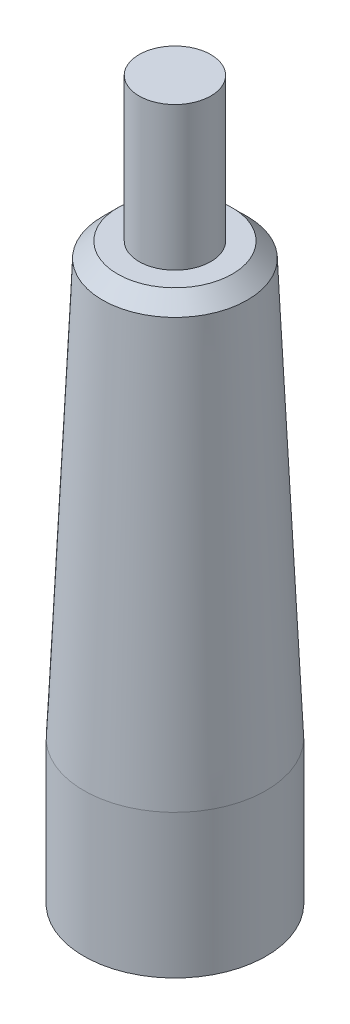
ISO-10303-21;
HEADER;
FILE_DESCRIPTION(('STEP AP214'),'2;1');
FILE_NAME('part.step','',(''),(''),'','','');
FILE_SCHEMA(('AUTOMOTIVE_DESIGN { 1 0 10303 214 1 1 1 1 }'));
ENDSEC;
DATA;
#1=APPLICATION_CONTEXT('core data for automotive mechanical design processes');
#2=APPLICATION_PROTOCOL_DEFINITION('international standard','automotive_design',2000,#1);
#3=PRODUCT_CONTEXT('',#1,'mechanical');
#4=PRODUCT('Part','Part','',(#3));
#5=PRODUCT_RELATED_PRODUCT_CATEGORY('part','',(#4));
#6=PRODUCT_DEFINITION_FORMATION('','',#4);
#7=PRODUCT_DEFINITION_CONTEXT('part definition',#1,'design');
#8=PRODUCT_DEFINITION('design','',#6,#7);
#9=PRODUCT_DEFINITION_SHAPE('','',#8);
#10=(LENGTH_UNIT() NAMED_UNIT(*) SI_UNIT(.MILLI.,.METRE.));
#11=(NAMED_UNIT(*) PLANE_ANGLE_UNIT() SI_UNIT($,.RADIAN.));
#12=(NAMED_UNIT(*) SI_UNIT($,.STERADIAN.) SOLID_ANGLE_UNIT());
#13=UNCERTAINTY_MEASURE_WITH_UNIT(LENGTH_MEASURE(1.E-05),#10,'distance_accuracy_value','');
#14=(GEOMETRIC_REPRESENTATION_CONTEXT(3) GLOBAL_UNCERTAINTY_ASSIGNED_CONTEXT((#13)) GLOBAL_UNIT_ASSIGNED_CONTEXT((#10,
#11,#12)) REPRESENTATION_CONTEXT('',''));
#15=CARTESIAN_POINT('',(0.,0.,0.));
#16=DIRECTION('',(0.,0.,1.));
#17=DIRECTION('',(1.,0.,0.));
#18=AXIS2_PLACEMENT_3D('',#15,#16,#17);
#19=CARTESIAN_POINT('',(3.175,0.,0.));
#20=DIRECTION('',(0.,-1.,0.));
#21=DIRECTION('',(0.,0.,-1.));
#22=AXIS2_PLACEMENT_3D('',#19,#20,#21);
#23=PLANE('',#22);
#24=CARTESIAN_POINT('',(0.,0.,0.));
#25=DIRECTION('',(0.,-1.,0.));
#26=DIRECTION('',(0.,0.,-1.));
#27=AXIS2_PLACEMENT_3D('',#24,#25,#26);
#28=CIRCLE('',#27,3.175);
#29=CARTESIAN_POINT('',(0.,0.,-3.175));
#30=VERTEX_POINT('',#29);
#31=EDGE_CURVE('E54',#30,#30,#28,.T.);
#32=ORIENTED_EDGE('',*,*,#31,.T.);
#33=EDGE_LOOP('',(#32));
#34=FACE_BOUND('',#33,.T.);
#35=ADVANCED_FACE('F31',(#34),#23,.T.);
#36=CARTESIAN_POINT('',(0.,25.,0.));
#37=DIRECTION('',(0.,1.,0.));
#38=DIRECTION('',(0.,0.,1.));
#39=AXIS2_PLACEMENT_3D('',#36,#37,#38);
#40=PLANE('',#39);
#41=CARTESIAN_POINT('',(0.,25.,0.));
#42=DIRECTION('',(0.,-1.,0.));
#43=DIRECTION('',(0.,0.,-1.));
#44=AXIS2_PLACEMENT_3D('',#41,#42,#43);
#45=CIRCLE('',#44,1.25);
#46=CARTESIAN_POINT('',(0.,25.,-1.25));
#47=VERTEX_POINT('',#46);
#48=EDGE_CURVE('E42',#47,#47,#45,.T.);
#49=ORIENTED_EDGE('',*,*,#48,.F.);
#50=EDGE_LOOP('',(#49));
#51=FACE_BOUND('',#50,.T.);
#52=ADVANCED_FACE('F72',(#51),#40,.T.);
#53=CARTESIAN_POINT('',(0.,0.,0.));
#54=DIRECTION('',(0.,-1.,0.));
#55=DIRECTION('',(0.,0.,-1.));
#56=AXIS2_PLACEMENT_3D('',#53,#54,#55);
#57=CYLINDRICAL_SURFACE('',#56,1.25);
#58=ORIENTED_EDGE('',*,*,#48,.T.);
#59=EDGE_LOOP('',(#58));
#60=FACE_BOUND('',#59,.T.);
#61=CARTESIAN_POINT('',(0.,20.,0.));
#62=DIRECTION('',(0.,-1.,0.));
#63=DIRECTION('',(0.,0.,-1.));
#64=AXIS2_PLACEMENT_3D('',#61,#62,#63);
#65=CIRCLE('',#64,1.25);
#66=CARTESIAN_POINT('',(0.,20.,-1.25));
#67=VERTEX_POINT('',#66);
#68=EDGE_CURVE('E46',#67,#67,#65,.T.);
#69=ORIENTED_EDGE('',*,*,#68,.F.);
#70=EDGE_LOOP('',(#69));
#71=FACE_BOUND('',#70,.T.);
#72=ADVANCED_FACE('F76',(#60,#71),#57,.T.);
#73=CARTESIAN_POINT('',(1.25,20.,0.));
#74=DIRECTION('',(0.,1.,0.));
#75=DIRECTION('',(0.,0.,1.));
#76=AXIS2_PLACEMENT_3D('',#73,#74,#75);
#77=PLANE('',#76);
#78=CARTESIAN_POINT('',(0.,20.,0.));
#79=DIRECTION('',(0.,1.,0.));
#80=DIRECTION('',(0.,0.,1.));
#81=AXIS2_PLACEMENT_3D('',#78,#79,#80);
#82=CIRCLE('',#81,2.00000000000002);
#83=CARTESIAN_POINT('',(0.,20.,2.00000000000002));
#84=VERTEX_POINT('',#83);
#85=EDGE_CURVE('E10',#84,#84,#82,.T.);
#86=ORIENTED_EDGE('',*,*,#85,.T.);
#87=EDGE_LOOP('',(#86));
#88=FACE_BOUND('',#87,.T.);
#89=ORIENTED_EDGE('',*,*,#68,.T.);
#90=EDGE_LOOP('',(#89));
#91=FACE_BOUND('',#90,.T.);
#92=ADVANCED_FACE('F69',(#88,#91),#77,.T.);
#93=CARTESIAN_POINT('',(0.,5.,0.));
#94=DIRECTION('',(0.,-1.,0.));
#95=DIRECTION('',(0.,0.,-1.));
#96=AXIS2_PLACEMENT_3D('',#93,#94,#95);
#97=CONICAL_SURFACE('',#96,3.175,0.0449696618523275);
#98=CARTESIAN_POINT('',(0.,19.4764397905759,0.));
#99=DIRECTION('',(0.,1.,0.));
#100=DIRECTION('',(0.,0.,1.));
#101=AXIS2_PLACEMENT_3D('',#98,#99,#100);
#102=CIRCLE('',#101,2.52356020942408);
#103=CARTESIAN_POINT('',(0.,19.4764397905759,2.52356020942408));
#104=VERTEX_POINT('',#103);
#105=EDGE_CURVE('E38',#104,#104,#102,.F.);
#106=ORIENTED_EDGE('',*,*,#105,.T.);
#107=EDGE_LOOP('',(#106));
#108=FACE_BOUND('',#107,.T.);
#109=CARTESIAN_POINT('',(0.,5.,0.));
#110=DIRECTION('',(0.,-1.,0.));
#111=DIRECTION('',(0.,0.,-1.));
#112=AXIS2_PLACEMENT_3D('',#109,#110,#111);
#113=CIRCLE('',#112,3.175);
#114=CARTESIAN_POINT('',(0.,5.,-3.175));
#115=VERTEX_POINT('',#114);
#116=EDGE_CURVE('E51',#115,#115,#113,.T.);
#117=ORIENTED_EDGE('',*,*,#116,.F.);
#118=EDGE_LOOP('',(#117));
#119=FACE_BOUND('',#118,.T.);
#120=ADVANCED_FACE('F61',(#108,#119),#97,.T.);
#121=CARTESIAN_POINT('',(0.,0.,0.));
#122=DIRECTION('',(0.,-1.,0.));
#123=DIRECTION('',(0.,0.,-1.));
#124=AXIS2_PLACEMENT_3D('',#121,#122,#123);
#125=CYLINDRICAL_SURFACE('',#124,3.175);
#126=ORIENTED_EDGE('',*,*,#116,.T.);
#127=EDGE_LOOP('',(#126));
#128=FACE_BOUND('',#127,.T.);
#129=ORIENTED_EDGE('',*,*,#31,.F.);
#130=EDGE_LOOP('',(#129));
#131=FACE_BOUND('',#130,.T.);
#132=ADVANCED_FACE('F59',(#128,#131),#125,.T.);
#133=CARTESIAN_POINT('',(0.,19.4764397905759,0.));
#134=DIRECTION('',(0.,-1.,0.));
#135=DIRECTION('',(0.,0.,-1.));
#136=AXIS2_PLACEMENT_3D('',#133,#134,#135);
#137=CONICAL_SURFACE('',#136,2.52356020942408,0.785398163397456);
#138=ORIENTED_EDGE('',*,*,#85,.F.);
#139=EDGE_LOOP('',(#138));
#140=FACE_BOUND('',#139,.T.);
#141=ORIENTED_EDGE('',*,*,#105,.F.);
#142=EDGE_LOOP('',(#141));
#143=FACE_BOUND('',#142,.T.);
#144=ADVANCED_FACE('F33',(#140,#143),#137,.T.);
#145=CLOSED_SHELL('',(#35,#52,#72,#92,#120,#132,#144));
#146=MANIFOLD_SOLID_BREP('B2',#145);
#147=ADVANCED_BREP_SHAPE_REPRESENTATION('',(#18,#146),#14);
#148=SHAPE_DEFINITION_REPRESENTATION(#9,#147);
ENDSEC;
END-ISO-10303-21;
